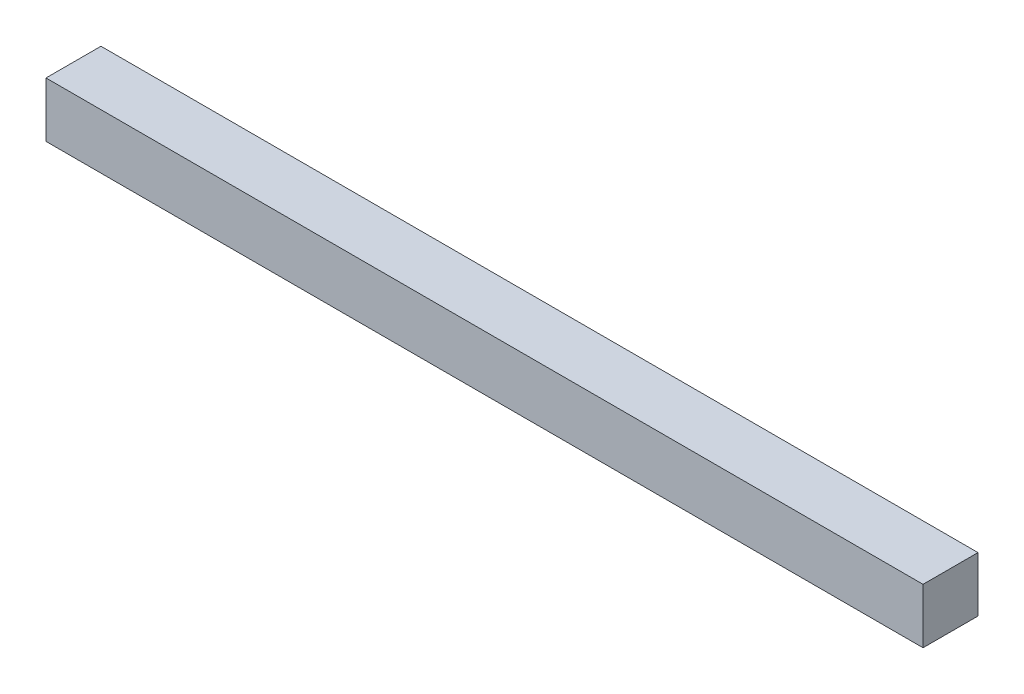
ISO-10303-21;
HEADER;
FILE_DESCRIPTION(('STEP AP214'),'2;1');
FILE_NAME('part.step','',(''),(''),'','','');
FILE_SCHEMA(('AUTOMOTIVE_DESIGN { 1 0 10303 214 1 1 1 1 }'));
ENDSEC;
DATA;
#1=APPLICATION_CONTEXT('core data for automotive mechanical design processes');
#2=APPLICATION_PROTOCOL_DEFINITION('international standard','automotive_design',2000,#1);
#3=PRODUCT_CONTEXT('',#1,'mechanical');
#4=PRODUCT('Part','Part','',(#3));
#5=PRODUCT_RELATED_PRODUCT_CATEGORY('part','',(#4));
#6=PRODUCT_DEFINITION_FORMATION('','',#4);
#7=PRODUCT_DEFINITION_CONTEXT('part definition',#1,'design');
#8=PRODUCT_DEFINITION('design','',#6,#7);
#9=PRODUCT_DEFINITION_SHAPE('','',#8);
#10=(LENGTH_UNIT() NAMED_UNIT(*) SI_UNIT(.MILLI.,.METRE.));
#11=(NAMED_UNIT(*) PLANE_ANGLE_UNIT() SI_UNIT($,.RADIAN.));
#12=(NAMED_UNIT(*) SI_UNIT($,.STERADIAN.) SOLID_ANGLE_UNIT());
#13=UNCERTAINTY_MEASURE_WITH_UNIT(LENGTH_MEASURE(1.E-05),#10,'distance_accuracy_value','');
#14=(GEOMETRIC_REPRESENTATION_CONTEXT(3) GLOBAL_UNCERTAINTY_ASSIGNED_CONTEXT((#13)) GLOBAL_UNIT_ASSIGNED_CONTEXT((#10,
#11,#12)) REPRESENTATION_CONTEXT('',''));
#15=CARTESIAN_POINT('',(0.,0.,0.));
#16=DIRECTION('',(0.,0.,1.));
#17=DIRECTION('',(1.,0.,0.));
#18=AXIS2_PLACEMENT_3D('',#15,#16,#17);
#19=CARTESIAN_POINT('',(0.,0.,-18.));
#20=DIRECTION('',(0.,1.,0.));
#21=DIRECTION('',(0.,0.,1.));
#22=AXIS2_PLACEMENT_3D('',#19,#20,#21);
#23=PLANE('',#22);
#24=DIRECTION('',(-1.,0.,0.));
#25=VECTOR('',#24,1.);
#26=CARTESIAN_POINT('',(0.,0.,0.));
#27=LINE('',#26,#25);
#28=CARTESIAN_POINT('',(287.21,0.,0.));
#29=VERTEX_POINT('',#28);
#30=CARTESIAN_POINT('',(0.,0.,0.));
#31=VERTEX_POINT('',#30);
#32=EDGE_CURVE('E97',#29,#31,#27,.T.);
#33=ORIENTED_EDGE('',*,*,#32,.F.);
#34=DIRECTION('',(0.,0.,1.));
#35=VECTOR('',#34,1.);
#36=CARTESIAN_POINT('',(287.21,0.,-18.));
#37=LINE('',#36,#35);
#38=CARTESIAN_POINT('',(287.21,0.,-18.));
#39=VERTEX_POINT('',#38);
#40=EDGE_CURVE('E11',#39,#29,#37,.T.);
#41=ORIENTED_EDGE('',*,*,#40,.F.);
#42=DIRECTION('',(-1.,0.,0.));
#43=VECTOR('',#42,1.);
#44=CARTESIAN_POINT('',(0.,0.,-18.));
#45=LINE('',#44,#43);
#46=CARTESIAN_POINT('',(0.,0.,-18.));
#47=VERTEX_POINT('',#46);
#48=EDGE_CURVE('E91',#39,#47,#45,.T.);
#49=ORIENTED_EDGE('',*,*,#48,.T.);
#50=DIRECTION('',(0.,0.,1.));
#51=VECTOR('',#50,1.);
#52=CARTESIAN_POINT('',(0.,0.,-18.));
#53=LINE('',#52,#51);
#54=EDGE_CURVE('E36',#47,#31,#53,.T.);
#55=ORIENTED_EDGE('',*,*,#54,.T.);
#56=EDGE_LOOP('',(#33,#41,#49,#55));
#57=FACE_BOUND('',#56,.T.);
#58=ADVANCED_FACE('F33',(#57),#23,.T.);
#59=CARTESIAN_POINT('',(287.21,-18.,-18.));
#60=DIRECTION('',(1.,0.,0.));
#61=DIRECTION('',(0.,0.,-1.));
#62=AXIS2_PLACEMENT_3D('',#59,#60,#61);
#63=PLANE('',#62);
#64=DIRECTION('',(0.,1.,0.));
#65=VECTOR('',#64,1.);
#66=CARTESIAN_POINT('',(287.21,-18.,0.));
#67=LINE('',#66,#65);
#68=CARTESIAN_POINT('',(287.21,-18.,0.));
#69=VERTEX_POINT('',#68);
#70=EDGE_CURVE('E93',#69,#29,#67,.T.);
#71=ORIENTED_EDGE('',*,*,#70,.F.);
#72=DIRECTION('',(0.,0.,1.));
#73=VECTOR('',#72,1.);
#74=CARTESIAN_POINT('',(287.21,-18.,-18.));
#75=LINE('',#74,#73);
#76=CARTESIAN_POINT('',(287.21,-18.,-18.));
#77=VERTEX_POINT('',#76);
#78=EDGE_CURVE('E42',#77,#69,#75,.T.);
#79=ORIENTED_EDGE('',*,*,#78,.F.);
#80=DIRECTION('',(0.,1.,0.));
#81=VECTOR('',#80,1.);
#82=CARTESIAN_POINT('',(287.21,-18.,-18.));
#83=LINE('',#82,#81);
#84=EDGE_CURVE('E88',#77,#39,#83,.T.);
#85=ORIENTED_EDGE('',*,*,#84,.T.);
#86=ORIENTED_EDGE('',*,*,#40,.T.);
#87=EDGE_LOOP('',(#71,#79,#85,#86));
#88=FACE_BOUND('',#87,.T.);
#89=ADVANCED_FACE('F107',(#88),#63,.T.);
#90=CARTESIAN_POINT('',(0.,-18.,-18.));
#91=DIRECTION('',(0.,-1.,0.));
#92=DIRECTION('',(0.,0.,-1.));
#93=AXIS2_PLACEMENT_3D('',#90,#91,#92);
#94=PLANE('',#93);
#95=DIRECTION('',(1.,0.,0.));
#96=VECTOR('',#95,1.);
#97=CARTESIAN_POINT('',(0.,-18.,0.));
#98=LINE('',#97,#96);
#99=CARTESIAN_POINT('',(0.,-18.,0.));
#100=VERTEX_POINT('',#99);
#101=EDGE_CURVE('E83',#100,#69,#98,.T.);
#102=ORIENTED_EDGE('',*,*,#101,.F.);
#103=DIRECTION('',(0.,0.,1.));
#104=VECTOR('',#103,1.);
#105=CARTESIAN_POINT('',(0.,-18.,-18.));
#106=LINE('',#105,#104);
#107=CARTESIAN_POINT('',(0.,-18.,-18.));
#108=VERTEX_POINT('',#107);
#109=EDGE_CURVE('E78',#108,#100,#106,.T.);
#110=ORIENTED_EDGE('',*,*,#109,.F.);
#111=DIRECTION('',(1.,0.,0.));
#112=VECTOR('',#111,1.);
#113=CARTESIAN_POINT('',(0.,-18.,-18.));
#114=LINE('',#113,#112);
#115=EDGE_CURVE('E81',#108,#77,#114,.T.);
#116=ORIENTED_EDGE('',*,*,#115,.T.);
#117=ORIENTED_EDGE('',*,*,#78,.T.);
#118=EDGE_LOOP('',(#102,#110,#116,#117));
#119=FACE_BOUND('',#118,.T.);
#120=ADVANCED_FACE('F80',(#119),#94,.T.);
#121=CARTESIAN_POINT('',(0.,0.,-18.));
#122=DIRECTION('',(-1.,0.,0.));
#123=DIRECTION('',(0.,-1.,0.));
#124=AXIS2_PLACEMENT_3D('',#121,#122,#123);
#125=PLANE('',#124);
#126=DIRECTION('',(0.,-1.,0.));
#127=VECTOR('',#126,1.);
#128=CARTESIAN_POINT('',(0.,0.,0.));
#129=LINE('',#128,#127);
#130=EDGE_CURVE('E100',#31,#100,#129,.T.);
#131=ORIENTED_EDGE('',*,*,#130,.F.);
#132=ORIENTED_EDGE('',*,*,#54,.F.);
#133=DIRECTION('',(0.,-1.,0.));
#134=VECTOR('',#133,1.);
#135=CARTESIAN_POINT('',(0.,0.,-18.));
#136=LINE('',#135,#134);
#137=EDGE_CURVE('E87',#47,#108,#136,.T.);
#138=ORIENTED_EDGE('',*,*,#137,.T.);
#139=ORIENTED_EDGE('',*,*,#109,.T.);
#140=EDGE_LOOP('',(#131,#132,#138,#139));
#141=FACE_BOUND('',#140,.T.);
#142=ADVANCED_FACE('F90',(#141),#125,.T.);
#143=CARTESIAN_POINT('',(0.,0.,-18.));
#144=DIRECTION('',(0.,0.,1.));
#145=DIRECTION('',(1.,0.,0.));
#146=AXIS2_PLACEMENT_3D('',#143,#144,#145);
#147=PLANE('',#146);
#148=ORIENTED_EDGE('',*,*,#48,.F.);
#149=ORIENTED_EDGE('',*,*,#84,.F.);
#150=ORIENTED_EDGE('',*,*,#115,.F.);
#151=ORIENTED_EDGE('',*,*,#137,.F.);
#152=EDGE_LOOP('',(#148,#149,#150,#151));
#153=FACE_BOUND('',#152,.T.);
#154=ADVANCED_FACE('F86',(#153),#147,.F.);
#155=CARTESIAN_POINT('',(0.,0.,0.));
#156=DIRECTION('',(0.,0.,1.));
#157=DIRECTION('',(1.,0.,0.));
#158=AXIS2_PLACEMENT_3D('',#155,#156,#157);
#159=PLANE('',#158);
#160=ORIENTED_EDGE('',*,*,#32,.T.);
#161=ORIENTED_EDGE('',*,*,#130,.T.);
#162=ORIENTED_EDGE('',*,*,#101,.T.);
#163=ORIENTED_EDGE('',*,*,#70,.T.);
#164=EDGE_LOOP('',(#160,#161,#162,#163));
#165=FACE_BOUND('',#164,.T.);
#166=ADVANCED_FACE('F106',(#165),#159,.T.);
#167=CLOSED_SHELL('',(#58,#89,#120,#142,#154,#166));
#168=MANIFOLD_SOLID_BREP('B2',#167);
#169=ADVANCED_BREP_SHAPE_REPRESENTATION('',(#18,#168),#14);
#170=SHAPE_DEFINITION_REPRESENTATION(#9,#169);
ENDSEC;
END-ISO-10303-21;
